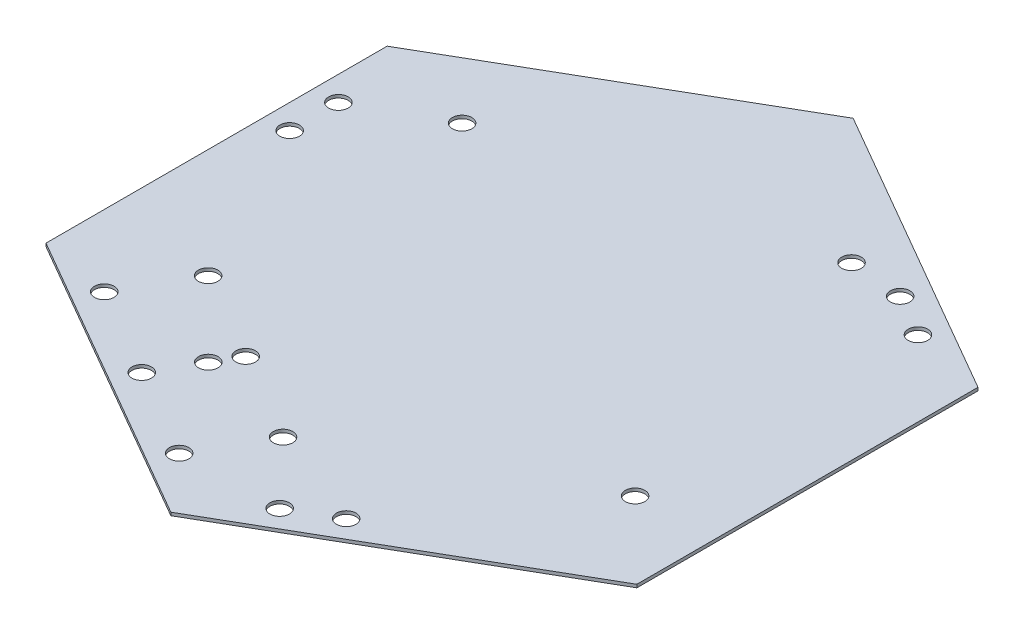
ISO-10303-21;
HEADER;
FILE_DESCRIPTION(('STEP AP214'),'2;1');
FILE_NAME('part.step','',(''),(''),'','','');
FILE_SCHEMA(('AUTOMOTIVE_DESIGN { 1 0 10303 214 1 1 1 1 }'));
ENDSEC;
DATA;
#1=APPLICATION_CONTEXT('core data for automotive mechanical design processes');
#2=APPLICATION_PROTOCOL_DEFINITION('international standard','automotive_design',2000,#1);
#3=PRODUCT_CONTEXT('',#1,'mechanical');
#4=PRODUCT('Part','Part','',(#3));
#5=PRODUCT_RELATED_PRODUCT_CATEGORY('part','',(#4));
#6=PRODUCT_DEFINITION_FORMATION('','',#4);
#7=PRODUCT_DEFINITION_CONTEXT('part definition',#1,'design');
#8=PRODUCT_DEFINITION('design','',#6,#7);
#9=PRODUCT_DEFINITION_SHAPE('','',#8);
#10=(LENGTH_UNIT() NAMED_UNIT(*) SI_UNIT(.MILLI.,.METRE.));
#11=(NAMED_UNIT(*) PLANE_ANGLE_UNIT() SI_UNIT($,.RADIAN.));
#12=(NAMED_UNIT(*) SI_UNIT($,.STERADIAN.) SOLID_ANGLE_UNIT());
#13=UNCERTAINTY_MEASURE_WITH_UNIT(LENGTH_MEASURE(1.E-05),#10,'distance_accuracy_value','');
#14=(GEOMETRIC_REPRESENTATION_CONTEXT(3) GLOBAL_UNCERTAINTY_ASSIGNED_CONTEXT((#13)) GLOBAL_UNIT_ASSIGNED_CONTEXT((#10,
#11,#12)) REPRESENTATION_CONTEXT('',''));
#15=CARTESIAN_POINT('',(0.,0.,0.));
#16=DIRECTION('',(0.,0.,1.));
#17=DIRECTION('',(1.,0.,0.));
#18=AXIS2_PLACEMENT_3D('',#15,#16,#17);
#19=CARTESIAN_POINT('',(0.,0.8128,0.));
#20=DIRECTION('',(0.,1.,0.));
#21=DIRECTION('',(0.,0.,1.));
#22=AXIS2_PLACEMENT_3D('',#19,#20,#21);
#23=PLANE('',#22);
#24=CARTESIAN_POINT('',(-2.31694409957988,0.8128,57.3530362153385));
#25=DIRECTION('',(0.,1.,0.));
#26=DIRECTION('',(0.,0.,1.));
#27=AXIS2_PLACEMENT_3D('',#24,#25,#26);
#28=CIRCLE('',#27,2.54);
#29=CARTESIAN_POINT('',(-2.31694409957988,0.8128,59.8930362153385));
#30=VERTEX_POINT('',#29);
#31=EDGE_CURVE('E184',#30,#30,#28,.T.);
#32=ORIENTED_EDGE('',*,*,#31,.F.);
#33=EDGE_LOOP('',(#32));
#34=FACE_BOUND('',#33,.T.);
#35=CARTESIAN_POINT('',(-12.2229316792871,0.8128,74.5107386859692));
#36=DIRECTION('',(0.,1.,0.));
#37=DIRECTION('',(0.,0.,1.));
#38=AXIS2_PLACEMENT_3D('',#35,#36,#37);
#39=CIRCLE('',#38,2.54);
#40=CARTESIAN_POINT('',(-12.2229316792871,0.8128,77.0507386859692));
#41=VERTEX_POINT('',#40);
#42=EDGE_CURVE('E345',#41,#41,#39,.T.);
#43=ORIENTED_EDGE('',*,*,#42,.F.);
#44=EDGE_LOOP('',(#43));
#45=FACE_BOUND('',#44,.T.);
#46=CARTESIAN_POINT('',(-58.416726717149,0.8128,47.8407386859692));
#47=DIRECTION('',(0.,1.,0.));
#48=DIRECTION('',(0.,0.,1.));
#49=AXIS2_PLACEMENT_3D('',#46,#47,#48);
#50=CIRCLE('',#49,2.54);
#51=CARTESIAN_POINT('',(-58.416726717149,0.8128,50.3807386859692));
#52=VERTEX_POINT('',#51);
#53=EDGE_CURVE('E341',#52,#52,#50,.T.);
#54=ORIENTED_EDGE('',*,*,#53,.F.);
#55=EDGE_LOOP('',(#54));
#56=FACE_BOUND('',#55,.T.);
#57=CARTESIAN_POINT('',(-48.5107142968621,0.8128,30.6830505570539));
#58=DIRECTION('',(0.,1.,0.));
#59=DIRECTION('',(0.,0.,1.));
#60=AXIS2_PLACEMENT_3D('',#57,#58,#59);
#61=CIRCLE('',#60,2.54);
#62=CARTESIAN_POINT('',(-48.5107142968621,0.8128,33.2230505570539));
#63=VERTEX_POINT('',#62);
#64=EDGE_CURVE('E337',#63,#63,#61,.T.);
#65=ORIENTED_EDGE('',*,*,#64,.F.);
#66=EDGE_LOOP('',(#65));
#67=FACE_BOUND('',#66,.T.);
#68=CARTESIAN_POINT('',(-35.3198291982179,0.8128,61.175738685969));
#69=DIRECTION('',(0.,1.,0.));
#70=DIRECTION('',(0.,0.,1.));
#71=AXIS2_PLACEMENT_3D('',#68,#69,#70);
#72=CIRCLE('',#71,2.54000000000007);
#73=CARTESIAN_POINT('',(-35.3198291982179,0.8128,63.715738685969));
#74=VERTEX_POINT('',#73);
#75=EDGE_CURVE('E208',#74,#74,#72,.T.);
#76=ORIENTED_EDGE('',*,*,#75,.F.);
#77=EDGE_LOOP('',(#76));
#78=FACE_BOUND('',#77,.T.);
#79=CARTESIAN_POINT('',(-28.969829198218,0.8128,50.1772160579065));
#80=DIRECTION('',(0.,1.,0.));
#81=DIRECTION('',(0.,0.,1.));
#82=AXIS2_PLACEMENT_3D('',#79,#80,#81);
#83=CIRCLE('',#82,2.54000000000008);
#84=CARTESIAN_POINT('',(-28.969829198218,0.8128,52.7172160579066));
#85=VERTEX_POINT('',#84);
#86=EDGE_CURVE('E195',#85,#85,#83,.T.);
#87=ORIENTED_EDGE('',*,*,#86,.F.);
#88=EDGE_LOOP('',(#87));
#89=FACE_BOUND('',#88,.T.);
#90=CARTESIAN_POINT('',(-49.8503347461025,0.8128,-36.8466874454343));
#91=DIRECTION('',(0.,1.,0.));
#92=DIRECTION('',(0.,0.,1.));
#93=AXIS2_PLACEMENT_3D('',#90,#91,#92);
#94=CIRCLE('',#93,2.53999999999999);
#95=CARTESIAN_POINT('',(-49.8503347461025,0.8128,-34.3066874454343));
#96=VERTEX_POINT('',#95);
#97=EDGE_CURVE('E217',#96,#96,#94,.T.);
#98=ORIENTED_EDGE('',*,*,#97,.F.);
#99=EDGE_LOOP('',(#98));
#100=FACE_BOUND('',#99,.T.);
#101=CARTESIAN_POINT('',(-25.4,0.8128,43.9940905122494));
#102=DIRECTION('',(0.,1.,0.));
#103=DIRECTION('',(0.,0.,1.));
#104=AXIS2_PLACEMENT_3D('',#101,#102,#103);
#105=CIRCLE('',#104,2.53999999999999);
#106=CARTESIAN_POINT('',(-25.4,0.8128,46.5340905122494));
#107=VERTEX_POINT('',#106);
#108=EDGE_CURVE('E225',#107,#107,#105,.T.);
#109=ORIENTED_EDGE('',*,*,#108,.F.);
#110=EDGE_LOOP('',(#109));
#111=FACE_BOUND('',#110,.T.);
#112=CARTESIAN_POINT('',(32.385,0.8128,-56.0924654031182));
#113=DIRECTION('',(0.,1.,0.));
#114=DIRECTION('',(0.,0.,1.));
#115=AXIS2_PLACEMENT_3D('',#112,#113,#114);
#116=CIRCLE('',#115,2.53999999999999);
#117=CARTESIAN_POINT('',(32.385,0.8128,-53.5524654031182));
#118=VERTEX_POINT('',#117);
#119=EDGE_CURVE('E233',#118,#118,#116,.T.);
#120=ORIENTED_EDGE('',*,*,#119,.F.);
#121=EDGE_LOOP('',(#120));
#122=FACE_BOUND('',#121,.T.);
#123=CARTESIAN_POINT('',(56.8353347461025,0.8128,24.7483125545657));
#124=DIRECTION('',(0.,1.,0.));
#125=DIRECTION('',(0.,0.,1.));
#126=AXIS2_PLACEMENT_3D('',#123,#124,#125);
#127=CIRCLE('',#126,2.53999999999997);
#128=CARTESIAN_POINT('',(56.8353347461025,0.8128,27.2883125545657));
#129=VERTEX_POINT('',#128);
#130=EDGE_CURVE('E241',#129,#129,#127,.T.);
#131=ORIENTED_EDGE('',*,*,#130,.F.);
#132=EDGE_LOOP('',(#131));
#133=FACE_BOUND('',#132,.T.);
#134=CARTESIAN_POINT('',(57.3168744543434,0.8128,-48.4757386859689));
#135=DIRECTION('',(0.,1.,0.));
#136=DIRECTION('',(0.,0.,1.));
#137=AXIS2_PLACEMENT_3D('',#134,#135,#136);
#138=CIRCLE('',#137,2.53999999999999);
#139=CARTESIAN_POINT('',(57.3168744543434,0.8128,-45.9357386859689));
#140=VERTEX_POINT('',#139);
#141=EDGE_CURVE('E254',#140,#140,#138,.T.);
#142=ORIENTED_EDGE('',*,*,#141,.F.);
#143=EDGE_LOOP('',(#142));
#144=FACE_BOUND('',#143,.T.);
#145=CARTESIAN_POINT('',(-70.6396583964365,0.8128,-25.4000000000004));
#146=DIRECTION('',(0.,1.,0.));
#147=DIRECTION('',(0.,0.,1.));
#148=AXIS2_PLACEMENT_3D('',#145,#146,#147);
#149=CIRCLE('',#148,2.54);
#150=CARTESIAN_POINT('',(-70.6396583964365,0.8128,-22.8600000000004));
#151=VERTEX_POINT('',#150);
#152=EDGE_CURVE('E270',#151,#151,#149,.T.);
#153=ORIENTED_EDGE('',*,*,#152,.F.);
#154=EDGE_LOOP('',(#153));
#155=FACE_BOUND('',#154,.T.);
#156=CARTESIAN_POINT('',(13.3227839420935,0.8128,73.8757386859688));
#157=DIRECTION('',(0.,1.,0.));
#158=DIRECTION('',(0.,0.,1.));
#159=AXIS2_PLACEMENT_3D('',#156,#157,#158);
#160=CIRCLE('',#159,2.53999999999999);
#161=CARTESIAN_POINT('',(13.3227839420935,0.8128,76.4157386859688));
#162=VERTEX_POINT('',#161);
#163=EDGE_CURVE('E157',#162,#162,#160,.T.);
#164=ORIENTED_EDGE('',*,*,#163,.F.);
#165=EDGE_LOOP('',(#164));
#166=FACE_BOUND('',#165,.T.);
#167=DIRECTION('',(-0.866025403784442,0.,-0.499999999999995));
#168=VECTOR('',#167,1.);
#169=CARTESIAN_POINT('',(76.9896583964361,0.8128,-44.4500000000009));
#170=LINE('',#169,#168);
#171=CARTESIAN_POINT('',(76.9896583964361,0.8128,-44.4500000000009));
#172=VERTEX_POINT('',#171);
#173=CARTESIAN_POINT('',(0.,0.8128,-88.9));
#174=VERTEX_POINT('',#173);
#175=EDGE_CURVE('E169',#172,#174,#170,.T.);
#176=ORIENTED_EDGE('',*,*,#175,.T.);
#177=DIRECTION('',(-0.866025403784438,0.,0.500000000000001));
#178=VECTOR('',#177,1.);
#179=CARTESIAN_POINT('',(0.,0.8128,-88.9));
#180=LINE('',#179,#178);
#181=CARTESIAN_POINT('',(-76.9896583964367,0.8128,-44.4499999999998));
#182=VERTEX_POINT('',#181);
#183=EDGE_CURVE('E116',#174,#182,#180,.T.);
#184=ORIENTED_EDGE('',*,*,#183,.T.);
#185=DIRECTION('',(0.,0.,1.));
#186=VECTOR('',#185,1.);
#187=CARTESIAN_POINT('',(-76.9896583964367,0.8128,-44.4499999999998));
#188=LINE('',#187,#186);
#189=CARTESIAN_POINT('',(-76.9896583964364,0.8128,44.4500000000004));
#190=VERTEX_POINT('',#189);
#191=EDGE_CURVE('E129',#182,#190,#188,.T.);
#192=ORIENTED_EDGE('',*,*,#191,.T.);
#193=DIRECTION('',(0.866025403784442,0.,0.499999999999995));
#194=VECTOR('',#193,1.);
#195=CARTESIAN_POINT('',(-76.9896583964364,0.8128,44.4500000000004));
#196=LINE('',#195,#194);
#197=CARTESIAN_POINT('',(6.20785382046309E-13,0.8128,88.9));
#198=VERTEX_POINT('',#197);
#199=EDGE_CURVE('E123',#190,#198,#196,.T.);
#200=ORIENTED_EDGE('',*,*,#199,.T.);
#201=DIRECTION('',(0.866025403784434,0.,-0.500000000000007));
#202=VECTOR('',#201,1.);
#203=CARTESIAN_POINT('',(6.20785382046309E-13,0.8128,88.9));
#204=LINE('',#203,#202);
#205=CARTESIAN_POINT('',(76.989658396437,0.8128,44.4499999999993));
#206=VERTEX_POINT('',#205);
#207=EDGE_CURVE('E127',#198,#206,#204,.T.);
#208=ORIENTED_EDGE('',*,*,#207,.T.);
#209=DIRECTION('',(0.,0.,-1.));
#210=VECTOR('',#209,1.);
#211=CARTESIAN_POINT('',(76.989658396437,0.8128,44.4499999999993));
#212=LINE('',#211,#210);
#213=EDGE_CURVE('E79',#206,#172,#212,.T.);
#214=ORIENTED_EDGE('',*,*,#213,.T.);
#215=EDGE_LOOP('',(#176,#184,#192,#200,#208,#214));
#216=FACE_BOUND('',#215,.T.);
#217=CARTESIAN_POINT('',(24.3213065701559,0.8128,67.5257386859688));
#218=DIRECTION('',(0.,1.,0.));
#219=DIRECTION('',(0.,0.,1.));
#220=AXIS2_PLACEMENT_3D('',#217,#218,#219);
#221=CIRCLE('',#220,2.53999999999999);
#222=CARTESIAN_POINT('',(24.3213065701559,0.8128,70.0657386859688));
#223=VERTEX_POINT('',#222);
#224=EDGE_CURVE('E278',#223,#223,#221,.T.);
#225=ORIENTED_EDGE('',*,*,#224,.F.);
#226=EDGE_LOOP('',(#225));
#227=FACE_BOUND('',#226,.T.);
#228=CARTESIAN_POINT('',(-70.6396583964365,0.8128,-12.7000000000003));
#229=DIRECTION('',(0.,1.,0.));
#230=DIRECTION('',(0.,0.,1.));
#231=AXIS2_PLACEMENT_3D('',#228,#229,#230);
#232=CIRCLE('',#231,2.53999999999999);
#233=CARTESIAN_POINT('',(-70.6396583964365,0.8128,-10.1600000000004));
#234=VERTEX_POINT('',#233);
#235=EDGE_CURVE('E262',#234,#234,#232,.T.);
#236=ORIENTED_EDGE('',*,*,#235,.F.);
#237=EDGE_LOOP('',(#236));
#238=FACE_BOUND('',#237,.T.);
#239=CARTESIAN_POINT('',(46.318351826281,0.8128,-54.825738685969));
#240=DIRECTION('',(0.,1.,0.));
#241=DIRECTION('',(0.,0.,1.));
#242=AXIS2_PLACEMENT_3D('',#239,#240,#241);
#243=CIRCLE('',#242,2.53999999999999);
#244=CARTESIAN_POINT('',(46.318351826281,0.8128,-52.285738685969));
#245=VERTEX_POINT('',#244);
#246=EDGE_CURVE('E246',#245,#245,#243,.T.);
#247=ORIENTED_EDGE('',*,*,#246,.F.);
#248=EDGE_LOOP('',(#247));
#249=FACE_BOUND('',#248,.T.);
#250=ADVANCED_FACE('F59',(#34,#45,#56,#67,#78,#89,#100,#111,#122,#133,#144,#155,#166,#216,#227,
#238,#249),#23,.T.);
#251=CARTESIAN_POINT('',(0.,0.,0.));
#252=DIRECTION('',(0.,1.,0.));
#253=DIRECTION('',(0.,0.,1.));
#254=AXIS2_PLACEMENT_3D('',#251,#252,#253);
#255=PLANE('',#254);
#256=CARTESIAN_POINT('',(-2.31694409957988,0.,57.3530362153385));
#257=DIRECTION('',(0.,1.,0.));
#258=DIRECTION('',(0.,0.,1.));
#259=AXIS2_PLACEMENT_3D('',#256,#257,#258);
#260=CIRCLE('',#259,2.54);
#261=CARTESIAN_POINT('',(-2.31694409957988,0.,59.8930362153385));
#262=VERTEX_POINT('',#261);
#263=EDGE_CURVE('E63',#262,#262,#260,.T.);
#264=ORIENTED_EDGE('',*,*,#263,.T.);
#265=EDGE_LOOP('',(#264));
#266=FACE_BOUND('',#265,.T.);
#267=CARTESIAN_POINT('',(-12.2229316792871,0.,74.5107386859692));
#268=DIRECTION('',(0.,1.,0.));
#269=DIRECTION('',(0.,0.,1.));
#270=AXIS2_PLACEMENT_3D('',#267,#268,#269);
#271=CIRCLE('',#270,2.54);
#272=CARTESIAN_POINT('',(-12.2229316792871,0.,77.0507386859692));
#273=VERTEX_POINT('',#272);
#274=EDGE_CURVE('E187',#273,#273,#271,.T.);
#275=ORIENTED_EDGE('',*,*,#274,.T.);
#276=EDGE_LOOP('',(#275));
#277=FACE_BOUND('',#276,.T.);
#278=CARTESIAN_POINT('',(-58.416726717149,0.,47.8407386859692));
#279=DIRECTION('',(0.,1.,0.));
#280=DIRECTION('',(0.,0.,1.));
#281=AXIS2_PLACEMENT_3D('',#278,#279,#280);
#282=CIRCLE('',#281,2.54);
#283=CARTESIAN_POINT('',(-58.416726717149,0.,50.3807386859692));
#284=VERTEX_POINT('',#283);
#285=EDGE_CURVE('E183',#284,#284,#282,.T.);
#286=ORIENTED_EDGE('',*,*,#285,.T.);
#287=EDGE_LOOP('',(#286));
#288=FACE_BOUND('',#287,.T.);
#289=CARTESIAN_POINT('',(-48.5107142968621,0.,30.6830505570539));
#290=DIRECTION('',(0.,1.,0.));
#291=DIRECTION('',(0.,0.,1.));
#292=AXIS2_PLACEMENT_3D('',#289,#290,#291);
#293=CIRCLE('',#292,2.54);
#294=CARTESIAN_POINT('',(-48.5107142968621,0.,33.2230505570539));
#295=VERTEX_POINT('',#294);
#296=EDGE_CURVE('E179',#295,#295,#293,.T.);
#297=ORIENTED_EDGE('',*,*,#296,.T.);
#298=EDGE_LOOP('',(#297));
#299=FACE_BOUND('',#298,.T.);
#300=CARTESIAN_POINT('',(-35.3198291982179,0.,61.175738685969));
#301=DIRECTION('',(0.,1.,0.));
#302=DIRECTION('',(0.,0.,1.));
#303=AXIS2_PLACEMENT_3D('',#300,#301,#302);
#304=CIRCLE('',#303,2.54000000000007);
#305=CARTESIAN_POINT('',(-35.3198291982179,0.,63.715738685969));
#306=VERTEX_POINT('',#305);
#307=EDGE_CURVE('E245',#306,#306,#304,.T.);
#308=ORIENTED_EDGE('',*,*,#307,.T.);
#309=EDGE_LOOP('',(#308));
#310=FACE_BOUND('',#309,.T.);
#311=CARTESIAN_POINT('',(-28.969829198218,0.,50.1772160579065));
#312=DIRECTION('',(0.,1.,0.));
#313=DIRECTION('',(0.,0.,1.));
#314=AXIS2_PLACEMENT_3D('',#311,#312,#313);
#315=CIRCLE('',#314,2.54000000000008);
#316=CARTESIAN_POINT('',(-28.969829198218,0.,52.7172160579066));
#317=VERTEX_POINT('',#316);
#318=EDGE_CURVE('E201',#317,#317,#315,.T.);
#319=ORIENTED_EDGE('',*,*,#318,.T.);
#320=EDGE_LOOP('',(#319));
#321=FACE_BOUND('',#320,.T.);
#322=CARTESIAN_POINT('',(-49.8503347461025,0.,-36.8466874454343));
#323=DIRECTION('',(0.,1.,0.));
#324=DIRECTION('',(0.,0.,1.));
#325=AXIS2_PLACEMENT_3D('',#322,#323,#324);
#326=CIRCLE('',#325,2.53999999999999);
#327=CARTESIAN_POINT('',(-49.8503347461025,0.,-34.3066874454343));
#328=VERTEX_POINT('',#327);
#329=EDGE_CURVE('E212',#328,#328,#326,.T.);
#330=ORIENTED_EDGE('',*,*,#329,.T.);
#331=EDGE_LOOP('',(#330));
#332=FACE_BOUND('',#331,.T.);
#333=CARTESIAN_POINT('',(-25.4,0.,43.9940905122494));
#334=DIRECTION('',(0.,1.,0.));
#335=DIRECTION('',(0.,0.,1.));
#336=AXIS2_PLACEMENT_3D('',#333,#334,#335);
#337=CIRCLE('',#336,2.53999999999999);
#338=CARTESIAN_POINT('',(-25.4,0.,46.5340905122494));
#339=VERTEX_POINT('',#338);
#340=EDGE_CURVE('E221',#339,#339,#337,.T.);
#341=ORIENTED_EDGE('',*,*,#340,.T.);
#342=EDGE_LOOP('',(#341));
#343=FACE_BOUND('',#342,.T.);
#344=CARTESIAN_POINT('',(32.385,0.,-56.0924654031182));
#345=DIRECTION('',(0.,1.,0.));
#346=DIRECTION('',(0.,0.,1.));
#347=AXIS2_PLACEMENT_3D('',#344,#345,#346);
#348=CIRCLE('',#347,2.53999999999999);
#349=CARTESIAN_POINT('',(32.385,0.,-53.5524654031182));
#350=VERTEX_POINT('',#349);
#351=EDGE_CURVE('E229',#350,#350,#348,.T.);
#352=ORIENTED_EDGE('',*,*,#351,.T.);
#353=EDGE_LOOP('',(#352));
#354=FACE_BOUND('',#353,.T.);
#355=CARTESIAN_POINT('',(56.8353347461025,0.,24.7483125545657));
#356=DIRECTION('',(0.,1.,0.));
#357=DIRECTION('',(0.,0.,1.));
#358=AXIS2_PLACEMENT_3D('',#355,#356,#357);
#359=CIRCLE('',#358,2.53999999999997);
#360=CARTESIAN_POINT('',(56.8353347461025,0.,27.2883125545657));
#361=VERTEX_POINT('',#360);
#362=EDGE_CURVE('E237',#361,#361,#359,.T.);
#363=ORIENTED_EDGE('',*,*,#362,.T.);
#364=EDGE_LOOP('',(#363));
#365=FACE_BOUND('',#364,.T.);
#366=DIRECTION('',(-0.866025403784442,0.,-0.499999999999995));
#367=VECTOR('',#366,1.);
#368=CARTESIAN_POINT('',(76.9896583964361,0.,-44.4500000000009));
#369=LINE('',#368,#367);
#370=CARTESIAN_POINT('',(76.9896583964361,0.,-44.4500000000009));
#371=VERTEX_POINT('',#370);
#372=CARTESIAN_POINT('',(0.,0.,-88.9));
#373=VERTEX_POINT('',#372);
#374=EDGE_CURVE('E152',#371,#373,#369,.T.);
#375=ORIENTED_EDGE('',*,*,#374,.F.);
#376=DIRECTION('',(0.,0.,-1.));
#377=VECTOR('',#376,1.);
#378=CARTESIAN_POINT('',(76.989658396437,0.,44.4499999999993));
#379=LINE('',#378,#377);
#380=CARTESIAN_POINT('',(76.989658396437,0.,44.4499999999993));
#381=VERTEX_POINT('',#380);
#382=EDGE_CURVE('E108',#381,#371,#379,.T.);
#383=ORIENTED_EDGE('',*,*,#382,.F.);
#384=DIRECTION('',(0.866025403784434,0.,-0.500000000000007));
#385=VECTOR('',#384,1.);
#386=CARTESIAN_POINT('',(6.20785382046309E-13,0.,88.9));
#387=LINE('',#386,#385);
#388=CARTESIAN_POINT('',(6.20785382046309E-13,0.,88.9));
#389=VERTEX_POINT('',#388);
#390=EDGE_CURVE('E102',#389,#381,#387,.T.);
#391=ORIENTED_EDGE('',*,*,#390,.F.);
#392=DIRECTION('',(0.866025403784442,0.,0.499999999999995));
#393=VECTOR('',#392,1.);
#394=CARTESIAN_POINT('',(-76.9896583964364,0.,44.4500000000004));
#395=LINE('',#394,#393);
#396=CARTESIAN_POINT('',(-76.9896583964364,0.,44.4500000000004));
#397=VERTEX_POINT('',#396);
#398=EDGE_CURVE('E138',#397,#389,#395,.T.);
#399=ORIENTED_EDGE('',*,*,#398,.F.);
#400=DIRECTION('',(0.,0.,1.));
#401=VECTOR('',#400,1.);
#402=CARTESIAN_POINT('',(-76.9896583964367,0.,-44.4499999999998));
#403=LINE('',#402,#401);
#404=CARTESIAN_POINT('',(-76.9896583964367,0.,-44.4499999999998));
#405=VERTEX_POINT('',#404);
#406=EDGE_CURVE('E160',#405,#397,#403,.T.);
#407=ORIENTED_EDGE('',*,*,#406,.F.);
#408=DIRECTION('',(-0.866025403784438,0.,0.500000000000001));
#409=VECTOR('',#408,1.);
#410=CARTESIAN_POINT('',(0.,0.,-88.9));
#411=LINE('',#410,#409);
#412=EDGE_CURVE('E156',#373,#405,#411,.T.);
#413=ORIENTED_EDGE('',*,*,#412,.F.);
#414=EDGE_LOOP('',(#375,#383,#391,#399,#407,#413));
#415=FACE_BOUND('',#414,.T.);
#416=CARTESIAN_POINT('',(13.3227839420935,0.,73.8757386859688));
#417=DIRECTION('',(0.,1.,0.));
#418=DIRECTION('',(0.,0.,1.));
#419=AXIS2_PLACEMENT_3D('',#416,#417,#418);
#420=CIRCLE('',#419,2.53999999999999);
#421=CARTESIAN_POINT('',(13.3227839420935,0.,76.4157386859688));
#422=VERTEX_POINT('',#421);
#423=EDGE_CURVE('E282',#422,#422,#420,.T.);
#424=ORIENTED_EDGE('',*,*,#423,.T.);
#425=EDGE_LOOP('',(#424));
#426=FACE_BOUND('',#425,.T.);
#427=CARTESIAN_POINT('',(24.3213065701559,0.,67.5257386859688));
#428=DIRECTION('',(0.,1.,0.));
#429=DIRECTION('',(0.,0.,1.));
#430=AXIS2_PLACEMENT_3D('',#427,#428,#429);
#431=CIRCLE('',#430,2.53999999999999);
#432=CARTESIAN_POINT('',(24.3213065701559,0.,70.0657386859688));
#433=VERTEX_POINT('',#432);
#434=EDGE_CURVE('E274',#433,#433,#431,.T.);
#435=ORIENTED_EDGE('',*,*,#434,.T.);
#436=EDGE_LOOP('',(#435));
#437=FACE_BOUND('',#436,.T.);
#438=CARTESIAN_POINT('',(-70.6396583964365,0.,-25.4000000000004));
#439=DIRECTION('',(0.,1.,0.));
#440=DIRECTION('',(0.,0.,1.));
#441=AXIS2_PLACEMENT_3D('',#438,#439,#440);
#442=CIRCLE('',#441,2.54);
#443=CARTESIAN_POINT('',(-70.6396583964365,0.,-22.8600000000004));
#444=VERTEX_POINT('',#443);
#445=EDGE_CURVE('E266',#444,#444,#442,.T.);
#446=ORIENTED_EDGE('',*,*,#445,.T.);
#447=EDGE_LOOP('',(#446));
#448=FACE_BOUND('',#447,.T.);
#449=CARTESIAN_POINT('',(-70.6396583964365,0.,-12.7000000000003));
#450=DIRECTION('',(0.,1.,0.));
#451=DIRECTION('',(0.,0.,1.));
#452=AXIS2_PLACEMENT_3D('',#449,#450,#451);
#453=CIRCLE('',#452,2.53999999999999);
#454=CARTESIAN_POINT('',(-70.6396583964365,0.,-10.1600000000004));
#455=VERTEX_POINT('',#454);
#456=EDGE_CURVE('E258',#455,#455,#453,.T.);
#457=ORIENTED_EDGE('',*,*,#456,.T.);
#458=EDGE_LOOP('',(#457));
#459=FACE_BOUND('',#458,.T.);
#460=CARTESIAN_POINT('',(57.3168744543434,0.,-48.4757386859689));
#461=DIRECTION('',(0.,1.,0.));
#462=DIRECTION('',(0.,0.,1.));
#463=AXIS2_PLACEMENT_3D('',#460,#461,#462);
#464=CIRCLE('',#463,2.53999999999999);
#465=CARTESIAN_POINT('',(57.3168744543434,0.,-45.9357386859689));
#466=VERTEX_POINT('',#465);
#467=EDGE_CURVE('E250',#466,#466,#464,.T.);
#468=ORIENTED_EDGE('',*,*,#467,.T.);
#469=EDGE_LOOP('',(#468));
#470=FACE_BOUND('',#469,.T.);
#471=CARTESIAN_POINT('',(46.318351826281,0.,-54.825738685969));
#472=DIRECTION('',(0.,1.,0.));
#473=DIRECTION('',(0.,0.,1.));
#474=AXIS2_PLACEMENT_3D('',#471,#472,#473);
#475=CIRCLE('',#474,2.53999999999999);
#476=CARTESIAN_POINT('',(46.318351826281,0.,-52.285738685969));
#477=VERTEX_POINT('',#476);
#478=EDGE_CURVE('E216',#477,#477,#475,.T.);
#479=ORIENTED_EDGE('',*,*,#478,.T.);
#480=EDGE_LOOP('',(#479));
#481=FACE_BOUND('',#480,.T.);
#482=ADVANCED_FACE('F359',(#266,#277,#288,#299,#310,#321,#332,#343,#354,#365,#415,#426,#437,
#448,#459,#470,#481),#255,.F.);
#483=CARTESIAN_POINT('',(76.9896583964361,0.8128,-44.4500000000009));
#484=DIRECTION('',(-0.499999999999995,0.,0.866025403784441));
#485=DIRECTION('',(0.866025403784441,0.,0.499999999999995));
#486=AXIS2_PLACEMENT_3D('',#483,#484,#485);
#487=PLANE('',#486);
#488=ORIENTED_EDGE('',*,*,#374,.T.);
#489=DIRECTION('',(0.,-1.,0.));
#490=VECTOR('',#489,1.);
#491=CARTESIAN_POINT('',(0.,0.8128,-88.9));
#492=LINE('',#491,#490);
#493=EDGE_CURVE('E13',#174,#373,#492,.T.);
#494=ORIENTED_EDGE('',*,*,#493,.F.);
#495=ORIENTED_EDGE('',*,*,#175,.F.);
#496=DIRECTION('',(0.,-1.,0.));
#497=VECTOR('',#496,1.);
#498=CARTESIAN_POINT('',(76.9896583964361,0.8128,-44.4500000000009));
#499=LINE('',#498,#497);
#500=EDGE_CURVE('E148',#172,#371,#499,.T.);
#501=ORIENTED_EDGE('',*,*,#500,.T.);
#502=EDGE_LOOP('',(#488,#494,#495,#501));
#503=FACE_BOUND('',#502,.T.);
#504=ADVANCED_FACE('F61',(#503),#487,.F.);
#505=CARTESIAN_POINT('',(0.,0.8128,-88.9));
#506=DIRECTION('',(0.500000000000001,0.,0.866025403784438));
#507=DIRECTION('',(0.866025403784438,0.,-0.500000000000001));
#508=AXIS2_PLACEMENT_3D('',#505,#506,#507);
#509=PLANE('',#508);
#510=ORIENTED_EDGE('',*,*,#412,.T.);
#511=DIRECTION('',(0.,-1.,0.));
#512=VECTOR('',#511,1.);
#513=CARTESIAN_POINT('',(-76.9896583964367,0.8128,-44.4499999999998));
#514=LINE('',#513,#512);
#515=EDGE_CURVE('E70',#182,#405,#514,.T.);
#516=ORIENTED_EDGE('',*,*,#515,.F.);
#517=ORIENTED_EDGE('',*,*,#183,.F.);
#518=ORIENTED_EDGE('',*,*,#493,.T.);
#519=EDGE_LOOP('',(#510,#516,#517,#518));
#520=FACE_BOUND('',#519,.T.);
#521=ADVANCED_FACE('F440',(#520),#509,.F.);
#522=CARTESIAN_POINT('',(-76.9896583964367,0.8128,-44.4499999999998));
#523=DIRECTION('',(1.,0.,0.));
#524=DIRECTION('',(0.,0.,-1.));
#525=AXIS2_PLACEMENT_3D('',#522,#523,#524);
#526=PLANE('',#525);
#527=ORIENTED_EDGE('',*,*,#406,.T.);
#528=DIRECTION('',(0.,-1.,0.));
#529=VECTOR('',#528,1.);
#530=CARTESIAN_POINT('',(-76.9896583964364,0.8128,44.4500000000004));
#531=LINE('',#530,#529);
#532=EDGE_CURVE('E140',#190,#397,#531,.T.);
#533=ORIENTED_EDGE('',*,*,#532,.F.);
#534=ORIENTED_EDGE('',*,*,#191,.F.);
#535=ORIENTED_EDGE('',*,*,#515,.T.);
#536=EDGE_LOOP('',(#527,#533,#534,#535));
#537=FACE_BOUND('',#536,.T.);
#538=ADVANCED_FACE('F438',(#537),#526,.F.);
#539=CARTESIAN_POINT('',(-76.9896583964364,0.8128,44.4500000000004));
#540=DIRECTION('',(0.499999999999995,0.,-0.866025403784442));
#541=DIRECTION('',(-0.866025403784442,0.,-0.499999999999995));
#542=AXIS2_PLACEMENT_3D('',#539,#540,#541);
#543=PLANE('',#542);
#544=ORIENTED_EDGE('',*,*,#398,.T.);
#545=DIRECTION('',(0.,-1.,0.));
#546=VECTOR('',#545,1.);
#547=CARTESIAN_POINT('',(6.20785382046309E-13,0.8128,88.9));
#548=LINE('',#547,#546);
#549=EDGE_CURVE('E135',#198,#389,#548,.T.);
#550=ORIENTED_EDGE('',*,*,#549,.F.);
#551=ORIENTED_EDGE('',*,*,#199,.F.);
#552=ORIENTED_EDGE('',*,*,#532,.T.);
#553=EDGE_LOOP('',(#544,#550,#551,#552));
#554=FACE_BOUND('',#553,.T.);
#555=ADVANCED_FACE('F136',(#554),#543,.F.);
#556=CARTESIAN_POINT('',(6.20785382046309E-13,0.8128,88.9));
#557=DIRECTION('',(-0.500000000000007,0.,-0.866025403784435));
#558=DIRECTION('',(-0.866025403784435,0.,0.500000000000007));
#559=AXIS2_PLACEMENT_3D('',#556,#557,#558);
#560=PLANE('',#559);
#561=ORIENTED_EDGE('',*,*,#390,.T.);
#562=DIRECTION('',(0.,-1.,0.));
#563=VECTOR('',#562,1.);
#564=CARTESIAN_POINT('',(76.989658396437,0.8128,44.4499999999993));
#565=LINE('',#564,#563);
#566=EDGE_CURVE('E141',#206,#381,#565,.T.);
#567=ORIENTED_EDGE('',*,*,#566,.F.);
#568=ORIENTED_EDGE('',*,*,#207,.F.);
#569=ORIENTED_EDGE('',*,*,#549,.T.);
#570=EDGE_LOOP('',(#561,#567,#568,#569));
#571=FACE_BOUND('',#570,.T.);
#572=ADVANCED_FACE('F143',(#571),#560,.F.);
#573=CARTESIAN_POINT('',(76.989658396437,0.8128,44.4499999999993));
#574=DIRECTION('',(-1.,0.,0.));
#575=DIRECTION('',(0.,0.,1.));
#576=AXIS2_PLACEMENT_3D('',#573,#574,#575);
#577=PLANE('',#576);
#578=ORIENTED_EDGE('',*,*,#382,.T.);
#579=ORIENTED_EDGE('',*,*,#500,.F.);
#580=ORIENTED_EDGE('',*,*,#213,.F.);
#581=ORIENTED_EDGE('',*,*,#566,.T.);
#582=EDGE_LOOP('',(#578,#579,#580,#581));
#583=FACE_BOUND('',#582,.T.);
#584=ADVANCED_FACE('F387',(#583),#577,.F.);
#585=CARTESIAN_POINT('',(13.3227839420935,0.8128,73.8757386859688));
#586=DIRECTION('',(0.,-1.,0.));
#587=DIRECTION('',(0.,0.,-1.));
#588=AXIS2_PLACEMENT_3D('',#585,#586,#587);
#589=CYLINDRICAL_SURFACE('',#588,2.53999999999999);
#590=ORIENTED_EDGE('',*,*,#163,.T.);
#591=EDGE_LOOP('',(#590));
#592=FACE_BOUND('',#591,.T.);
#593=ORIENTED_EDGE('',*,*,#423,.F.);
#594=EDGE_LOOP('',(#593));
#595=FACE_BOUND('',#594,.T.);
#596=ADVANCED_FACE('F383',(#592,#595),#589,.F.);
#597=CARTESIAN_POINT('',(24.3213065701559,0.8128,67.5257386859688));
#598=DIRECTION('',(0.,-1.,0.));
#599=DIRECTION('',(0.,0.,-1.));
#600=AXIS2_PLACEMENT_3D('',#597,#598,#599);
#601=CYLINDRICAL_SURFACE('',#600,2.53999999999999);
#602=ORIENTED_EDGE('',*,*,#224,.T.);
#603=EDGE_LOOP('',(#602));
#604=FACE_BOUND('',#603,.T.);
#605=ORIENTED_EDGE('',*,*,#434,.F.);
#606=EDGE_LOOP('',(#605));
#607=FACE_BOUND('',#606,.T.);
#608=ADVANCED_FACE('F386',(#604,#607),#601,.F.);
#609=CARTESIAN_POINT('',(-70.6396583964365,0.8128,-25.4000000000004));
#610=DIRECTION('',(0.,-1.,0.));
#611=DIRECTION('',(0.,0.,-1.));
#612=AXIS2_PLACEMENT_3D('',#609,#610,#611);
#613=CYLINDRICAL_SURFACE('',#612,2.54);
#614=ORIENTED_EDGE('',*,*,#152,.T.);
#615=EDGE_LOOP('',(#614));
#616=FACE_BOUND('',#615,.T.);
#617=ORIENTED_EDGE('',*,*,#445,.F.);
#618=EDGE_LOOP('',(#617));
#619=FACE_BOUND('',#618,.T.);
#620=ADVANCED_FACE('F424',(#616,#619),#613,.F.);
#621=CARTESIAN_POINT('',(-70.6396583964365,0.8128,-12.7000000000003));
#622=DIRECTION('',(0.,-1.,0.));
#623=DIRECTION('',(0.,0.,-1.));
#624=AXIS2_PLACEMENT_3D('',#621,#622,#623);
#625=CYLINDRICAL_SURFACE('',#624,2.53999999999999);
#626=ORIENTED_EDGE('',*,*,#235,.T.);
#627=EDGE_LOOP('',(#626));
#628=FACE_BOUND('',#627,.T.);
#629=ORIENTED_EDGE('',*,*,#456,.F.);
#630=EDGE_LOOP('',(#629));
#631=FACE_BOUND('',#630,.T.);
#632=ADVANCED_FACE('F417',(#628,#631),#625,.F.);
#633=CARTESIAN_POINT('',(57.3168744543434,0.8128,-48.4757386859689));
#634=DIRECTION('',(0.,-1.,0.));
#635=DIRECTION('',(0.,0.,-1.));
#636=AXIS2_PLACEMENT_3D('',#633,#634,#635);
#637=CYLINDRICAL_SURFACE('',#636,2.53999999999999);
#638=ORIENTED_EDGE('',*,*,#141,.T.);
#639=EDGE_LOOP('',(#638));
#640=FACE_BOUND('',#639,.T.);
#641=ORIENTED_EDGE('',*,*,#467,.F.);
#642=EDGE_LOOP('',(#641));
#643=FACE_BOUND('',#642,.T.);
#644=ADVANCED_FACE('F407',(#640,#643),#637,.F.);
#645=CARTESIAN_POINT('',(46.318351826281,0.8128,-54.825738685969));
#646=DIRECTION('',(0.,-1.,0.));
#647=DIRECTION('',(0.,0.,-1.));
#648=AXIS2_PLACEMENT_3D('',#645,#646,#647);
#649=CYLINDRICAL_SURFACE('',#648,2.53999999999999);
#650=ORIENTED_EDGE('',*,*,#246,.T.);
#651=EDGE_LOOP('',(#650));
#652=FACE_BOUND('',#651,.T.);
#653=ORIENTED_EDGE('',*,*,#478,.F.);
#654=EDGE_LOOP('',(#653));
#655=FACE_BOUND('',#654,.T.);
#656=ADVANCED_FACE('F404',(#652,#655),#649,.F.);
#657=CARTESIAN_POINT('',(56.8353347461025,0.,24.7483125545657));
#658=DIRECTION('',(0.,1.,0.));
#659=DIRECTION('',(0.,0.,1.));
#660=AXIS2_PLACEMENT_3D('',#657,#658,#659);
#661=CYLINDRICAL_SURFACE('',#660,2.53999999999997);
#662=ORIENTED_EDGE('',*,*,#362,.F.);
#663=EDGE_LOOP('',(#662));
#664=FACE_BOUND('',#663,.T.);
#665=ORIENTED_EDGE('',*,*,#130,.T.);
#666=EDGE_LOOP('',(#665));
#667=FACE_BOUND('',#666,.T.);
#668=ADVANCED_FACE('F406',(#664,#667),#661,.F.);
#669=CARTESIAN_POINT('',(32.385,0.,-56.0924654031182));
#670=DIRECTION('',(0.,1.,0.));
#671=DIRECTION('',(0.,0.,1.));
#672=AXIS2_PLACEMENT_3D('',#669,#670,#671);
#673=CYLINDRICAL_SURFACE('',#672,2.53999999999999);
#674=ORIENTED_EDGE('',*,*,#351,.F.);
#675=EDGE_LOOP('',(#674));
#676=FACE_BOUND('',#675,.T.);
#677=ORIENTED_EDGE('',*,*,#119,.T.);
#678=EDGE_LOOP('',(#677));
#679=FACE_BOUND('',#678,.T.);
#680=ADVANCED_FACE('F414',(#676,#679),#673,.F.);
#681=CARTESIAN_POINT('',(-25.4,0.,43.9940905122494));
#682=DIRECTION('',(0.,1.,0.));
#683=DIRECTION('',(0.,0.,1.));
#684=AXIS2_PLACEMENT_3D('',#681,#682,#683);
#685=CYLINDRICAL_SURFACE('',#684,2.53999999999999);
#686=ORIENTED_EDGE('',*,*,#340,.F.);
#687=EDGE_LOOP('',(#686));
#688=FACE_BOUND('',#687,.T.);
#689=ORIENTED_EDGE('',*,*,#108,.T.);
#690=EDGE_LOOP('',(#689));
#691=FACE_BOUND('',#690,.T.);
#692=ADVANCED_FACE('F542',(#688,#691),#685,.F.);
#693=CARTESIAN_POINT('',(-49.8503347461025,0.,-36.8466874454343));
#694=DIRECTION('',(0.,1.,0.));
#695=DIRECTION('',(0.,0.,1.));
#696=AXIS2_PLACEMENT_3D('',#693,#694,#695);
#697=CYLINDRICAL_SURFACE('',#696,2.53999999999999);
#698=ORIENTED_EDGE('',*,*,#329,.F.);
#699=EDGE_LOOP('',(#698));
#700=FACE_BOUND('',#699,.T.);
#701=ORIENTED_EDGE('',*,*,#97,.T.);
#702=EDGE_LOOP('',(#701));
#703=FACE_BOUND('',#702,.T.);
#704=ADVANCED_FACE('F535',(#700,#703),#697,.F.);
#705=CARTESIAN_POINT('',(-28.969829198218,0.,50.1772160579065));
#706=DIRECTION('',(0.,1.,0.));
#707=DIRECTION('',(0.,0.,1.));
#708=AXIS2_PLACEMENT_3D('',#705,#706,#707);
#709=CYLINDRICAL_SURFACE('',#708,2.54000000000008);
#710=ORIENTED_EDGE('',*,*,#318,.F.);
#711=EDGE_LOOP('',(#710));
#712=FACE_BOUND('',#711,.T.);
#713=ORIENTED_EDGE('',*,*,#86,.T.);
#714=EDGE_LOOP('',(#713));
#715=FACE_BOUND('',#714,.T.);
#716=ADVANCED_FACE('F528',(#712,#715),#709,.F.);
#717=CARTESIAN_POINT('',(-35.3198291982179,0.,61.175738685969));
#718=DIRECTION('',(0.,1.,0.));
#719=DIRECTION('',(0.,0.,1.));
#720=AXIS2_PLACEMENT_3D('',#717,#718,#719);
#721=CYLINDRICAL_SURFACE('',#720,2.54000000000007);
#722=ORIENTED_EDGE('',*,*,#307,.F.);
#723=EDGE_LOOP('',(#722));
#724=FACE_BOUND('',#723,.T.);
#725=ORIENTED_EDGE('',*,*,#75,.T.);
#726=EDGE_LOOP('',(#725));
#727=FACE_BOUND('',#726,.T.);
#728=ADVANCED_FACE('F470',(#724,#727),#721,.F.);
#729=CARTESIAN_POINT('',(-48.5107142968621,-1.7272,30.6830505570539));
#730=DIRECTION('',(0.,1.,0.));
#731=DIRECTION('',(0.,0.,1.));
#732=AXIS2_PLACEMENT_3D('',#729,#730,#731);
#733=CYLINDRICAL_SURFACE('',#732,2.54);
#734=ORIENTED_EDGE('',*,*,#64,.T.);
#735=EDGE_LOOP('',(#734));
#736=FACE_BOUND('',#735,.T.);
#737=ORIENTED_EDGE('',*,*,#296,.F.);
#738=EDGE_LOOP('',(#737));
#739=FACE_BOUND('',#738,.T.);
#740=ADVANCED_FACE('F480',(#736,#739),#733,.F.);
#741=CARTESIAN_POINT('',(-58.416726717149,-1.7272,47.8407386859692));
#742=DIRECTION('',(0.,1.,0.));
#743=DIRECTION('',(0.,0.,1.));
#744=AXIS2_PLACEMENT_3D('',#741,#742,#743);
#745=CYLINDRICAL_SURFACE('',#744,2.54);
#746=ORIENTED_EDGE('',*,*,#53,.T.);
#747=EDGE_LOOP('',(#746));
#748=FACE_BOUND('',#747,.T.);
#749=ORIENTED_EDGE('',*,*,#285,.F.);
#750=EDGE_LOOP('',(#749));
#751=FACE_BOUND('',#750,.T.);
#752=ADVANCED_FACE('F486',(#748,#751),#745,.F.);
#753=CARTESIAN_POINT('',(-12.2229316792871,-1.7272,74.5107386859692));
#754=DIRECTION('',(0.,1.,0.));
#755=DIRECTION('',(0.,0.,1.));
#756=AXIS2_PLACEMENT_3D('',#753,#754,#755);
#757=CYLINDRICAL_SURFACE('',#756,2.54);
#758=ORIENTED_EDGE('',*,*,#42,.T.);
#759=EDGE_LOOP('',(#758));
#760=FACE_BOUND('',#759,.T.);
#761=ORIENTED_EDGE('',*,*,#274,.F.);
#762=EDGE_LOOP('',(#761));
#763=FACE_BOUND('',#762,.T.);
#764=ADVANCED_FACE('F497',(#760,#763),#757,.F.);
#765=CARTESIAN_POINT('',(-2.31694409957988,-1.7272,57.3530362153385));
#766=DIRECTION('',(0.,1.,0.));
#767=DIRECTION('',(0.,0.,1.));
#768=AXIS2_PLACEMENT_3D('',#765,#766,#767);
#769=CYLINDRICAL_SURFACE('',#768,2.54);
#770=ORIENTED_EDGE('',*,*,#31,.T.);
#771=EDGE_LOOP('',(#770));
#772=FACE_BOUND('',#771,.T.);
#773=ORIENTED_EDGE('',*,*,#263,.F.);
#774=EDGE_LOOP('',(#773));
#775=FACE_BOUND('',#774,.T.);
#776=ADVANCED_FACE('F354',(#772,#775),#769,.F.);
#777=CLOSED_SHELL('',(#250,#482,#504,#521,#538,#555,#572,#584,#596,#608,#620,#632,#644,#656,
#668,#680,#692,#704,#716,#728,#740,#752,#764,#776));
#778=MANIFOLD_SOLID_BREP('B2',#777);
#779=ADVANCED_BREP_SHAPE_REPRESENTATION('',(#18,#778),#14);
#780=SHAPE_DEFINITION_REPRESENTATION(#9,#779);
ENDSEC;
END-ISO-10303-21;
